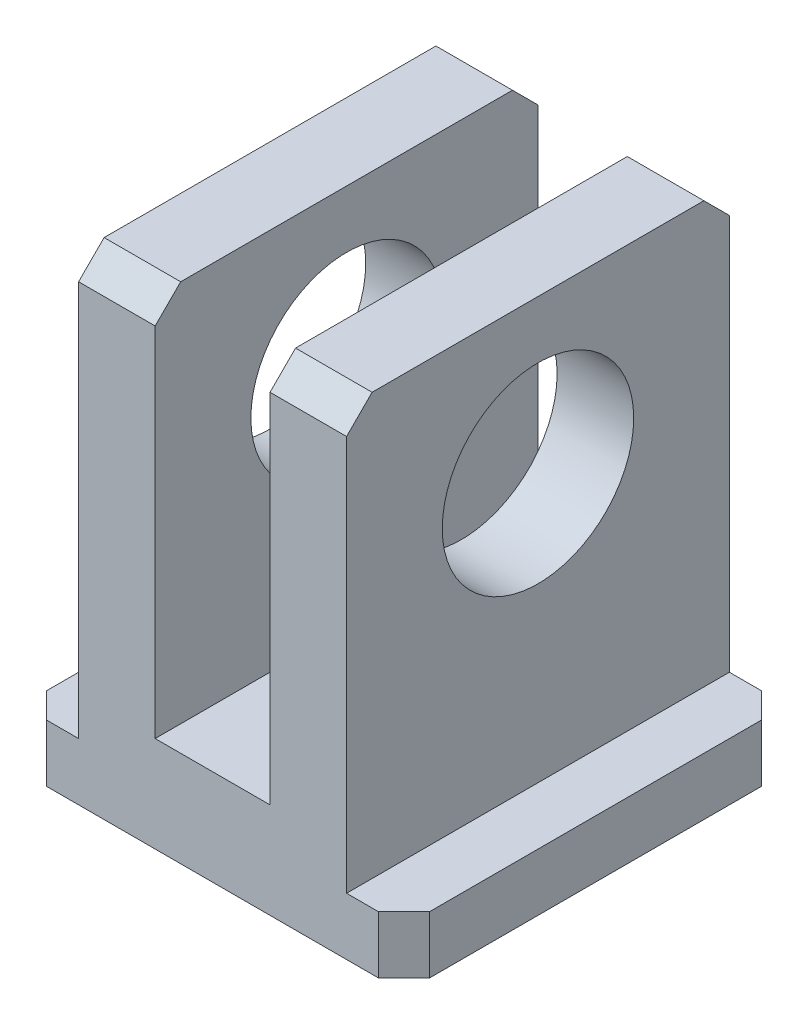
ISO-10303-21;
HEADER;
FILE_DESCRIPTION(('STEP AP214'),'2;1');
FILE_NAME('part.step','',(''),(''),'','','');
FILE_SCHEMA(('AUTOMOTIVE_DESIGN { 1 0 10303 214 1 1 1 1 }'));
ENDSEC;
DATA;
#1=APPLICATION_CONTEXT('core data for automotive mechanical design processes');
#2=APPLICATION_PROTOCOL_DEFINITION('international standard','automotive_design',2000,#1);
#3=PRODUCT_CONTEXT('',#1,'mechanical');
#4=PRODUCT('Part','Part','',(#3));
#5=PRODUCT_RELATED_PRODUCT_CATEGORY('part','',(#4));
#6=PRODUCT_DEFINITION_FORMATION('','',#4);
#7=PRODUCT_DEFINITION_CONTEXT('part definition',#1,'design');
#8=PRODUCT_DEFINITION('design','',#6,#7);
#9=PRODUCT_DEFINITION_SHAPE('','',#8);
#10=(LENGTH_UNIT() NAMED_UNIT(*) SI_UNIT(.MILLI.,.METRE.));
#11=(NAMED_UNIT(*) PLANE_ANGLE_UNIT() SI_UNIT($,.RADIAN.));
#12=(NAMED_UNIT(*) SI_UNIT($,.STERADIAN.) SOLID_ANGLE_UNIT());
#13=UNCERTAINTY_MEASURE_WITH_UNIT(LENGTH_MEASURE(1.E-05),#10,'distance_accuracy_value','');
#14=(GEOMETRIC_REPRESENTATION_CONTEXT(3) GLOBAL_UNCERTAINTY_ASSIGNED_CONTEXT((#13)) GLOBAL_UNIT_ASSIGNED_CONTEXT((#10,
#11,#12)) REPRESENTATION_CONTEXT('',''));
#15=CARTESIAN_POINT('',(0.,0.,0.));
#16=DIRECTION('',(0.,0.,1.));
#17=DIRECTION('',(1.,0.,0.));
#18=AXIS2_PLACEMENT_3D('',#15,#16,#17);
#19=CARTESIAN_POINT('',(-13.,4.5,-15.));
#20=DIRECTION('',(0.,0.,1.));
#21=DIRECTION('',(1.,0.,0.));
#22=AXIS2_PLACEMENT_3D('',#19,#20,#21);
#23=PLANE('',#22);
#24=DIRECTION('',(-1.,0.,0.));
#25=VECTOR('',#24,1.);
#26=CARTESIAN_POINT('',(40.5,35.5,-15.));
#27=LINE('',#26,#25);
#28=CARTESIAN_POINT('',(10.5,35.5,-15.));
#29=VERTEX_POINT('',#28);
#30=CARTESIAN_POINT('',(4.5,35.5,-15.));
#31=VERTEX_POINT('',#30);
#32=EDGE_CURVE('E342',#29,#31,#27,.T.);
#33=ORIENTED_EDGE('',*,*,#32,.F.);
#34=DIRECTION('',(0.,-1.,0.));
#35=VECTOR('',#34,1.);
#36=CARTESIAN_POINT('',(10.5,7.5,-15.));
#37=LINE('',#36,#35);
#38=CARTESIAN_POINT('',(10.5,4.5,-15.));
#39=VERTEX_POINT('',#38);
#40=EDGE_CURVE('E192',#29,#39,#37,.T.);
#41=ORIENTED_EDGE('',*,*,#40,.T.);
#42=DIRECTION('',(-1.,0.,0.));
#43=VECTOR('',#42,1.);
#44=CARTESIAN_POINT('',(-13.,4.5,-15.));
#45=LINE('',#44,#43);
#46=CARTESIAN_POINT('',(13.,4.5,-15.));
#47=VERTEX_POINT('',#46);
#48=EDGE_CURVE('E226',#47,#39,#45,.T.);
#49=ORIENTED_EDGE('',*,*,#48,.F.);
#50=DIRECTION('',(0.,-1.,0.));
#51=VECTOR('',#50,1.);
#52=CARTESIAN_POINT('',(13.,4.5,-15.));
#53=LINE('',#52,#51);
#54=CARTESIAN_POINT('',(13.,0.,-15.));
#55=VERTEX_POINT('',#54);
#56=EDGE_CURVE('E246',#47,#55,#53,.T.);
#57=ORIENTED_EDGE('',*,*,#56,.T.);
#58=DIRECTION('',(-1.,0.,0.));
#59=VECTOR('',#58,1.);
#60=CARTESIAN_POINT('',(-13.,0.,-15.));
#61=LINE('',#60,#59);
#62=CARTESIAN_POINT('',(-13.,0.,-15.));
#63=VERTEX_POINT('',#62);
#64=EDGE_CURVE('E225',#55,#63,#61,.T.);
#65=ORIENTED_EDGE('',*,*,#64,.T.);
#66=DIRECTION('',(0.,-1.,0.));
#67=VECTOR('',#66,1.);
#68=CARTESIAN_POINT('',(-13.,4.5,-15.));
#69=LINE('',#68,#67);
#70=CARTESIAN_POINT('',(-13.,4.5,-15.));
#71=VERTEX_POINT('',#70);
#72=EDGE_CURVE('E283',#71,#63,#69,.T.);
#73=ORIENTED_EDGE('',*,*,#72,.F.);
#74=CARTESIAN_POINT('',(-10.5,4.5,-15.));
#75=VERTEX_POINT('',#74);
#76=EDGE_CURVE('E230',#75,#71,#45,.T.);
#77=ORIENTED_EDGE('',*,*,#76,.F.);
#78=DIRECTION('',(0.,-1.,0.));
#79=VECTOR('',#78,1.);
#80=CARTESIAN_POINT('',(-10.5,7.5,-15.));
#81=LINE('',#80,#79);
#82=CARTESIAN_POINT('',(-10.5,35.5,-15.));
#83=VERTEX_POINT('',#82);
#84=EDGE_CURVE('E223',#83,#75,#81,.T.);
#85=ORIENTED_EDGE('',*,*,#84,.F.);
#86=CARTESIAN_POINT('',(-4.5,35.5,-15.));
#87=VERTEX_POINT('',#86);
#88=EDGE_CURVE('E183',#87,#83,#27,.T.);
#89=ORIENTED_EDGE('',*,*,#88,.F.);
#90=DIRECTION('',(0.,-1.,0.));
#91=VECTOR('',#90,1.);
#92=CARTESIAN_POINT('',(-4.5,37.5,-15.));
#93=LINE('',#92,#91);
#94=CARTESIAN_POINT('',(-4.5,7.5,-15.));
#95=VERTEX_POINT('',#94);
#96=EDGE_CURVE('E305',#87,#95,#93,.T.);
#97=ORIENTED_EDGE('',*,*,#96,.T.);
#98=DIRECTION('',(-1.,0.,0.));
#99=VECTOR('',#98,1.);
#100=CARTESIAN_POINT('',(-10.5,7.5,-15.));
#101=LINE('',#100,#99);
#102=CARTESIAN_POINT('',(4.5,7.5,-15.));
#103=VERTEX_POINT('',#102);
#104=EDGE_CURVE('E206',#103,#95,#101,.T.);
#105=ORIENTED_EDGE('',*,*,#104,.F.);
#106=DIRECTION('',(0.,-1.,0.));
#107=VECTOR('',#106,1.);
#108=CARTESIAN_POINT('',(4.5,37.5,-15.));
#109=LINE('',#108,#107);
#110=EDGE_CURVE('E198',#31,#103,#109,.T.);
#111=ORIENTED_EDGE('',*,*,#110,.F.);
#112=EDGE_LOOP('',(#33,#41,#49,#57,#65,#73,#77,#85,#89,#97,#105,#111));
#113=FACE_BOUND('',#112,.T.);
#114=ADVANCED_FACE('F41',(#113),#23,.F.);
#115=CARTESIAN_POINT('',(-13.,4.5,15.));
#116=DIRECTION('',(0.,0.,-1.));
#117=DIRECTION('',(-1.,0.,0.));
#118=AXIS2_PLACEMENT_3D('',#115,#116,#117);
#119=PLANE('',#118);
#120=DIRECTION('',(-1.,0.,0.));
#121=VECTOR('',#120,1.);
#122=CARTESIAN_POINT('',(40.5,35.5,15.));
#123=LINE('',#122,#121);
#124=CARTESIAN_POINT('',(-4.5,35.5,15.));
#125=VERTEX_POINT('',#124);
#126=CARTESIAN_POINT('',(-10.5,35.5,15.));
#127=VERTEX_POINT('',#126);
#128=EDGE_CURVE('E346',#125,#127,#123,.T.);
#129=ORIENTED_EDGE('',*,*,#128,.T.);
#130=DIRECTION('',(0.,-1.,0.));
#131=VECTOR('',#130,1.);
#132=CARTESIAN_POINT('',(-10.5,7.5,15.));
#133=LINE('',#132,#131);
#134=CARTESIAN_POINT('',(-10.5,4.5,15.));
#135=VERTEX_POINT('',#134);
#136=EDGE_CURVE('E221',#127,#135,#133,.T.);
#137=ORIENTED_EDGE('',*,*,#136,.T.);
#138=DIRECTION('',(1.,0.,0.));
#139=VECTOR('',#138,1.);
#140=CARTESIAN_POINT('',(-13.,4.5,15.));
#141=LINE('',#140,#139);
#142=CARTESIAN_POINT('',(-13.,4.5,15.));
#143=VERTEX_POINT('',#142);
#144=EDGE_CURVE('E237',#143,#135,#141,.T.);
#145=ORIENTED_EDGE('',*,*,#144,.F.);
#146=DIRECTION('',(0.,-1.,0.));
#147=VECTOR('',#146,1.);
#148=CARTESIAN_POINT('',(-13.,4.5,15.));
#149=LINE('',#148,#147);
#150=CARTESIAN_POINT('',(-13.,0.,15.));
#151=VERTEX_POINT('',#150);
#152=EDGE_CURVE('E274',#143,#151,#149,.T.);
#153=ORIENTED_EDGE('',*,*,#152,.T.);
#154=DIRECTION('',(1.,0.,0.));
#155=VECTOR('',#154,1.);
#156=CARTESIAN_POINT('',(-13.,0.,15.));
#157=LINE('',#156,#155);
#158=CARTESIAN_POINT('',(13.,0.,15.));
#159=VERTEX_POINT('',#158);
#160=EDGE_CURVE('E255',#151,#159,#157,.T.);
#161=ORIENTED_EDGE('',*,*,#160,.T.);
#162=DIRECTION('',(0.,-1.,0.));
#163=VECTOR('',#162,1.);
#164=CARTESIAN_POINT('',(13.,4.5,15.));
#165=LINE('',#164,#163);
#166=CARTESIAN_POINT('',(13.,4.5,15.));
#167=VERTEX_POINT('',#166);
#168=EDGE_CURVE('E271',#167,#159,#165,.T.);
#169=ORIENTED_EDGE('',*,*,#168,.F.);
#170=CARTESIAN_POINT('',(10.5,4.5,15.));
#171=VERTEX_POINT('',#170);
#172=EDGE_CURVE('E236',#171,#167,#141,.T.);
#173=ORIENTED_EDGE('',*,*,#172,.F.);
#174=DIRECTION('',(0.,-1.,0.));
#175=VECTOR('',#174,1.);
#176=CARTESIAN_POINT('',(10.5,7.5,15.));
#177=LINE('',#176,#175);
#178=CARTESIAN_POINT('',(10.5,35.5,15.));
#179=VERTEX_POINT('',#178);
#180=EDGE_CURVE('E219',#179,#171,#177,.T.);
#181=ORIENTED_EDGE('',*,*,#180,.F.);
#182=CARTESIAN_POINT('',(4.5,35.5,15.));
#183=VERTEX_POINT('',#182);
#184=EDGE_CURVE('E345',#179,#183,#123,.T.);
#185=ORIENTED_EDGE('',*,*,#184,.T.);
#186=DIRECTION('',(0.,-1.,0.));
#187=VECTOR('',#186,1.);
#188=CARTESIAN_POINT('',(4.5,37.5,15.));
#189=LINE('',#188,#187);
#190=CARTESIAN_POINT('',(4.5,7.5,15.));
#191=VERTEX_POINT('',#190);
#192=EDGE_CURVE('E202',#183,#191,#189,.T.);
#193=ORIENTED_EDGE('',*,*,#192,.T.);
#194=DIRECTION('',(1.,0.,0.));
#195=VECTOR('',#194,1.);
#196=CARTESIAN_POINT('',(-10.5,7.5,15.));
#197=LINE('',#196,#195);
#198=CARTESIAN_POINT('',(-4.5,7.5,15.));
#199=VERTEX_POINT('',#198);
#200=EDGE_CURVE('E209',#199,#191,#197,.T.);
#201=ORIENTED_EDGE('',*,*,#200,.F.);
#202=DIRECTION('',(0.,-1.,0.));
#203=VECTOR('',#202,1.);
#204=CARTESIAN_POINT('',(-4.5,37.5,15.));
#205=LINE('',#204,#203);
#206=EDGE_CURVE('E216',#125,#199,#205,.T.);
#207=ORIENTED_EDGE('',*,*,#206,.F.);
#208=EDGE_LOOP('',(#129,#137,#145,#153,#161,#169,#173,#181,#185,#193,#201,#207));
#209=FACE_BOUND('',#208,.T.);
#210=ADVANCED_FACE('F362',(#209),#119,.F.);
#211=CARTESIAN_POINT('',(-10.5,7.5,-15.));
#212=DIRECTION('',(1.,0.,0.));
#213=DIRECTION('',(0.,0.,-1.));
#214=AXIS2_PLACEMENT_3D('',#211,#212,#213);
#215=PLANE('',#214);
#216=DIRECTION('',(0.,-0.707106781186549,0.707106781186546));
#217=VECTOR('',#216,1.);
#218=CARTESIAN_POINT('',(-10.5,36.5,14.0000000000001));
#219=LINE('',#218,#217);
#220=CARTESIAN_POINT('',(-10.5,37.5,13.));
#221=VERTEX_POINT('',#220);
#222=EDGE_CURVE('E333',#221,#127,#219,.T.);
#223=ORIENTED_EDGE('',*,*,#222,.F.);
#224=DIRECTION('',(0.,0.,1.));
#225=VECTOR('',#224,1.);
#226=CARTESIAN_POINT('',(-10.5,37.5,15.));
#227=LINE('',#226,#225);
#228=CARTESIAN_POINT('',(-10.5,37.5,-13.));
#229=VERTEX_POINT('',#228);
#230=EDGE_CURVE('E309',#229,#221,#227,.T.);
#231=ORIENTED_EDGE('',*,*,#230,.F.);
#232=DIRECTION('',(0.,0.707106781186548,0.707106781186548));
#233=VECTOR('',#232,1.);
#234=CARTESIAN_POINT('',(-10.5,21.5,-29.));
#235=LINE('',#234,#233);
#236=EDGE_CURVE('E193',#83,#229,#235,.T.);
#237=ORIENTED_EDGE('',*,*,#236,.F.);
#238=ORIENTED_EDGE('',*,*,#84,.T.);
#239=DIRECTION('',(0.,0.,1.));
#240=VECTOR('',#239,1.);
#241=CARTESIAN_POINT('',(-10.5,4.5,-15.));
#242=LINE('',#241,#240);
#243=EDGE_CURVE('E213',#75,#135,#242,.T.);
#244=ORIENTED_EDGE('',*,*,#243,.T.);
#245=ORIENTED_EDGE('',*,*,#136,.F.);
#246=EDGE_LOOP('',(#223,#231,#237,#238,#244,#245));
#247=FACE_BOUND('',#246,.T.);
#248=CARTESIAN_POINT('',(-10.5,25.5,0.));
#249=DIRECTION('',(1.,0.,0.));
#250=DIRECTION('',(0.,0.,-1.));
#251=AXIS2_PLACEMENT_3D('',#248,#249,#250);
#252=CIRCLE('',#251,7.5);
#253=CARTESIAN_POINT('',(-10.5,25.5,-7.5));
#254=VERTEX_POINT('',#253);
#255=EDGE_CURVE('E318',#254,#254,#252,.F.);
#256=ORIENTED_EDGE('',*,*,#255,.F.);
#257=EDGE_LOOP('',(#256));
#258=FACE_BOUND('',#257,.T.);
#259=ADVANCED_FACE('F394',(#247,#258),#215,.F.);
#260=CARTESIAN_POINT('',(10.5,7.5,-15.));
#261=DIRECTION('',(-1.,0.,0.));
#262=DIRECTION('',(0.,0.,1.));
#263=AXIS2_PLACEMENT_3D('',#260,#261,#262);
#264=PLANE('',#263);
#265=DIRECTION('',(0.,0.707106781186549,-0.707106781186546));
#266=VECTOR('',#265,1.);
#267=CARTESIAN_POINT('',(10.5,36.5,14.));
#268=LINE('',#267,#266);
#269=CARTESIAN_POINT('',(10.5,37.5,13.));
#270=VERTEX_POINT('',#269);
#271=EDGE_CURVE('E56',#179,#270,#268,.T.);
#272=ORIENTED_EDGE('',*,*,#271,.F.);
#273=ORIENTED_EDGE('',*,*,#180,.T.);
#274=DIRECTION('',(0.,0.,-1.));
#275=VECTOR('',#274,1.);
#276=CARTESIAN_POINT('',(10.5,4.5,-15.));
#277=LINE('',#276,#275);
#278=EDGE_CURVE('E210',#171,#39,#277,.T.);
#279=ORIENTED_EDGE('',*,*,#278,.T.);
#280=ORIENTED_EDGE('',*,*,#40,.F.);
#281=DIRECTION('',(0.,-0.707106781186548,-0.707106781186548));
#282=VECTOR('',#281,1.);
#283=CARTESIAN_POINT('',(10.5,21.5,-29.));
#284=LINE('',#283,#282);
#285=CARTESIAN_POINT('',(10.5,37.5,-13.));
#286=VERTEX_POINT('',#285);
#287=EDGE_CURVE('E177',#286,#29,#284,.T.);
#288=ORIENTED_EDGE('',*,*,#287,.F.);
#289=DIRECTION('',(0.,0.,-1.));
#290=VECTOR('',#289,1.);
#291=CARTESIAN_POINT('',(10.5,37.5,15.));
#292=LINE('',#291,#290);
#293=EDGE_CURVE('E190',#270,#286,#292,.T.);
#294=ORIENTED_EDGE('',*,*,#293,.F.);
#295=EDGE_LOOP('',(#272,#273,#279,#280,#288,#294));
#296=FACE_BOUND('',#295,.T.);
#297=CARTESIAN_POINT('',(10.5,25.5,0.));
#298=DIRECTION('',(-1.,0.,0.));
#299=DIRECTION('',(0.,0.,1.));
#300=AXIS2_PLACEMENT_3D('',#297,#298,#299);
#301=CIRCLE('',#300,7.5);
#302=CARTESIAN_POINT('',(10.5,25.5,7.5));
#303=VERTEX_POINT('',#302);
#304=EDGE_CURVE('E324',#303,#303,#301,.F.);
#305=ORIENTED_EDGE('',*,*,#304,.F.);
#306=EDGE_LOOP('',(#305));
#307=FACE_BOUND('',#306,.T.);
#308=ADVANCED_FACE('F188',(#296,#307),#264,.F.);
#309=CARTESIAN_POINT('',(4.5,37.5,-15.));
#310=DIRECTION('',(1.,0.,0.));
#311=DIRECTION('',(0.,0.,-1.));
#312=AXIS2_PLACEMENT_3D('',#309,#310,#311);
#313=PLANE('',#312);
#314=DIRECTION('',(0.,-0.707106781186549,0.707106781186546));
#315=VECTOR('',#314,1.);
#316=CARTESIAN_POINT('',(4.5,51.5,-0.999999999999952));
#317=LINE('',#316,#315);
#318=CARTESIAN_POINT('',(4.5,37.5,13.));
#319=VERTEX_POINT('',#318);
#320=EDGE_CURVE('E336',#319,#183,#317,.T.);
#321=ORIENTED_EDGE('',*,*,#320,.F.);
#322=DIRECTION('',(0.,0.,1.));
#323=VECTOR('',#322,1.);
#324=CARTESIAN_POINT('',(4.5,37.5,-15.));
#325=LINE('',#324,#323);
#326=CARTESIAN_POINT('',(4.5,37.5,-13.));
#327=VERTEX_POINT('',#326);
#328=EDGE_CURVE('E197',#327,#319,#325,.T.);
#329=ORIENTED_EDGE('',*,*,#328,.F.);
#330=DIRECTION('',(0.,0.707106781186548,0.707106781186548));
#331=VECTOR('',#330,1.);
#332=CARTESIAN_POINT('',(4.5,36.5,-14.));
#333=LINE('',#332,#331);
#334=EDGE_CURVE('E64',#31,#327,#333,.T.);
#335=ORIENTED_EDGE('',*,*,#334,.F.);
#336=ORIENTED_EDGE('',*,*,#110,.T.);
#337=DIRECTION('',(0.,0.,1.));
#338=VECTOR('',#337,1.);
#339=CARTESIAN_POINT('',(4.5,7.5,-15.));
#340=LINE('',#339,#338);
#341=EDGE_CURVE('E200',#103,#191,#340,.T.);
#342=ORIENTED_EDGE('',*,*,#341,.T.);
#343=ORIENTED_EDGE('',*,*,#192,.F.);
#344=EDGE_LOOP('',(#321,#329,#335,#336,#342,#343));
#345=FACE_BOUND('',#344,.T.);
#346=CARTESIAN_POINT('',(4.5,25.5,0.));
#347=DIRECTION('',(1.,0.,0.));
#348=DIRECTION('',(0.,0.,-1.));
#349=AXIS2_PLACEMENT_3D('',#346,#347,#348);
#350=CIRCLE('',#349,7.5);
#351=CARTESIAN_POINT('',(4.5,25.5,-7.5));
#352=VERTEX_POINT('',#351);
#353=EDGE_CURVE('E328',#352,#352,#350,.F.);
#354=ORIENTED_EDGE('',*,*,#353,.F.);
#355=EDGE_LOOP('',(#354));
#356=FACE_BOUND('',#355,.T.);
#357=ADVANCED_FACE('F354',(#345,#356),#313,.F.);
#358=CARTESIAN_POINT('',(0.,37.5,0.));
#359=DIRECTION('',(0.,1.,0.));
#360=DIRECTION('',(0.,0.,1.));
#361=AXIS2_PLACEMENT_3D('',#358,#359,#360);
#362=PLANE('',#361);
#363=ORIENTED_EDGE('',*,*,#328,.T.);
#364=DIRECTION('',(-1.,0.,0.));
#365=VECTOR('',#364,1.);
#366=CARTESIAN_POINT('',(40.5,37.5,13.));
#367=LINE('',#366,#365);
#368=EDGE_CURVE('E196',#270,#319,#367,.T.);
#369=ORIENTED_EDGE('',*,*,#368,.F.);
#370=ORIENTED_EDGE('',*,*,#293,.T.);
#371=DIRECTION('',(-1.,0.,0.));
#372=VECTOR('',#371,1.);
#373=CARTESIAN_POINT('',(40.5,37.5,-13.));
#374=LINE('',#373,#372);
#375=EDGE_CURVE('E174',#286,#327,#374,.T.);
#376=ORIENTED_EDGE('',*,*,#375,.T.);
#377=EDGE_LOOP('',(#363,#369,#370,#376));
#378=FACE_BOUND('',#377,.T.);
#379=ADVANCED_FACE('F195',(#378),#362,.T.);
#380=CARTESIAN_POINT('',(-4.5,37.5,-15.));
#381=DIRECTION('',(-1.,0.,0.));
#382=DIRECTION('',(0.,0.,1.));
#383=AXIS2_PLACEMENT_3D('',#380,#381,#382);
#384=PLANE('',#383);
#385=DIRECTION('',(0.,0.707106781186549,-0.707106781186546));
#386=VECTOR('',#385,1.);
#387=CARTESIAN_POINT('',(-4.5,51.5,-0.999999999999947));
#388=LINE('',#387,#386);
#389=CARTESIAN_POINT('',(-4.5,37.5,13.));
#390=VERTEX_POINT('',#389);
#391=EDGE_CURVE('E338',#125,#390,#388,.T.);
#392=ORIENTED_EDGE('',*,*,#391,.F.);
#393=ORIENTED_EDGE('',*,*,#206,.T.);
#394=DIRECTION('',(0.,0.,-1.));
#395=VECTOR('',#394,1.);
#396=CARTESIAN_POINT('',(-4.5,7.5,-15.));
#397=LINE('',#396,#395);
#398=EDGE_CURVE('E312',#199,#95,#397,.T.);
#399=ORIENTED_EDGE('',*,*,#398,.T.);
#400=ORIENTED_EDGE('',*,*,#96,.F.);
#401=DIRECTION('',(0.,-0.707106781186548,-0.707106781186548));
#402=VECTOR('',#401,1.);
#403=CARTESIAN_POINT('',(-4.5,36.5,-14.));
#404=LINE('',#403,#402);
#405=CARTESIAN_POINT('',(-4.5,37.5,-13.));
#406=VERTEX_POINT('',#405);
#407=EDGE_CURVE('E290',#406,#87,#404,.T.);
#408=ORIENTED_EDGE('',*,*,#407,.F.);
#409=DIRECTION('',(0.,0.,-1.));
#410=VECTOR('',#409,1.);
#411=CARTESIAN_POINT('',(-4.5,37.5,-15.));
#412=LINE('',#411,#410);
#413=EDGE_CURVE('E303',#390,#406,#412,.T.);
#414=ORIENTED_EDGE('',*,*,#413,.F.);
#415=EDGE_LOOP('',(#392,#393,#399,#400,#408,#414));
#416=FACE_BOUND('',#415,.T.);
#417=CARTESIAN_POINT('',(-4.5,25.5,0.));
#418=DIRECTION('',(-1.,0.,0.));
#419=DIRECTION('',(0.,0.,1.));
#420=AXIS2_PLACEMENT_3D('',#417,#418,#419);
#421=CIRCLE('',#420,7.5);
#422=CARTESIAN_POINT('',(-4.5,25.5,7.5));
#423=VERTEX_POINT('',#422);
#424=EDGE_CURVE('E44',#423,#423,#421,.F.);
#425=ORIENTED_EDGE('',*,*,#424,.F.);
#426=EDGE_LOOP('',(#425));
#427=FACE_BOUND('',#426,.T.);
#428=ADVANCED_FACE('F301',(#416,#427),#384,.F.);
#429=CARTESIAN_POINT('',(0.,37.5,0.));
#430=DIRECTION('',(0.,-1.,0.));
#431=DIRECTION('',(0.,0.,-1.));
#432=AXIS2_PLACEMENT_3D('',#429,#430,#431);
#433=PLANE('',#432);
#434=DIRECTION('',(-1.,0.,0.));
#435=VECTOR('',#434,1.);
#436=CARTESIAN_POINT('',(0.,37.5,13.));
#437=LINE('',#436,#435);
#438=EDGE_CURVE('E11',#390,#221,#437,.T.);
#439=ORIENTED_EDGE('',*,*,#438,.F.);
#440=ORIENTED_EDGE('',*,*,#413,.T.);
#441=DIRECTION('',(1.,0.,0.));
#442=VECTOR('',#441,1.);
#443=CARTESIAN_POINT('',(0.,37.5,-13.));
#444=LINE('',#443,#442);
#445=EDGE_CURVE('E49',#229,#406,#444,.T.);
#446=ORIENTED_EDGE('',*,*,#445,.F.);
#447=ORIENTED_EDGE('',*,*,#230,.T.);
#448=EDGE_LOOP('',(#439,#440,#446,#447));
#449=FACE_BOUND('',#448,.T.);
#450=ADVANCED_FACE('F308',(#449),#433,.F.);
#451=CARTESIAN_POINT('',(0.,7.5,0.));
#452=DIRECTION('',(0.,-1.,0.));
#453=DIRECTION('',(0.,0.,-1.));
#454=AXIS2_PLACEMENT_3D('',#451,#452,#453);
#455=PLANE('',#454);
#456=ORIENTED_EDGE('',*,*,#398,.F.);
#457=ORIENTED_EDGE('',*,*,#200,.T.);
#458=ORIENTED_EDGE('',*,*,#341,.F.);
#459=ORIENTED_EDGE('',*,*,#104,.T.);
#460=EDGE_LOOP('',(#456,#457,#458,#459));
#461=FACE_BOUND('',#460,.T.);
#462=ADVANCED_FACE('F361',(#461),#455,.F.);
#463=CARTESIAN_POINT('',(0.,4.5,0.));
#464=DIRECTION('',(0.,1.,0.));
#465=DIRECTION('',(0.,0.,1.));
#466=AXIS2_PLACEMENT_3D('',#463,#464,#465);
#467=PLANE('',#466);
#468=ORIENTED_EDGE('',*,*,#278,.F.);
#469=ORIENTED_EDGE('',*,*,#172,.T.);
#470=DIRECTION('',(0.707106781186548,0.,-0.707106781186548));
#471=VECTOR('',#470,1.);
#472=CARTESIAN_POINT('',(13.,4.5,15.));
#473=LINE('',#472,#471);
#474=CARTESIAN_POINT('',(15.,4.5,13.));
#475=VERTEX_POINT('',#474);
#476=EDGE_CURVE('E240',#167,#475,#473,.T.);
#477=ORIENTED_EDGE('',*,*,#476,.T.);
#478=DIRECTION('',(0.,0.,-1.));
#479=VECTOR('',#478,1.);
#480=CARTESIAN_POINT('',(15.,4.5,13.));
#481=LINE('',#480,#479);
#482=CARTESIAN_POINT('',(15.,4.5,-13.));
#483=VERTEX_POINT('',#482);
#484=EDGE_CURVE('E242',#475,#483,#481,.T.);
#485=ORIENTED_EDGE('',*,*,#484,.T.);
#486=DIRECTION('',(-0.707106781186548,0.,-0.707106781186548));
#487=VECTOR('',#486,1.);
#488=CARTESIAN_POINT('',(13.,4.5,-15.));
#489=LINE('',#488,#487);
#490=EDGE_CURVE('E244',#483,#47,#489,.T.);
#491=ORIENTED_EDGE('',*,*,#490,.T.);
#492=ORIENTED_EDGE('',*,*,#48,.T.);
#493=EDGE_LOOP('',(#468,#469,#477,#485,#491,#492));
#494=FACE_BOUND('',#493,.T.);
#495=ADVANCED_FACE('F369',(#494),#467,.T.);
#496=CARTESIAN_POINT('',(-15.,4.5,-13.));
#497=DIRECTION('',(0.707106781186547,0.,0.707106781186547));
#498=DIRECTION('',(0.707106781186548,0.,-0.707106781186548));
#499=AXIS2_PLACEMENT_3D('',#496,#497,#498);
#500=PLANE('',#499);
#501=DIRECTION('',(-0.707106781186548,0.,0.707106781186548));
#502=VECTOR('',#501,1.);
#503=CARTESIAN_POINT('',(-15.,0.,-13.));
#504=LINE('',#503,#502);
#505=CARTESIAN_POINT('',(-15.,0.,-13.));
#506=VERTEX_POINT('',#505);
#507=EDGE_CURVE('E249',#63,#506,#504,.T.);
#508=ORIENTED_EDGE('',*,*,#507,.T.);
#509=DIRECTION('',(0.,-1.,0.));
#510=VECTOR('',#509,1.);
#511=CARTESIAN_POINT('',(-15.,4.5,-13.));
#512=LINE('',#511,#510);
#513=CARTESIAN_POINT('',(-15.,4.5,-13.));
#514=VERTEX_POINT('',#513);
#515=EDGE_CURVE('E280',#514,#506,#512,.T.);
#516=ORIENTED_EDGE('',*,*,#515,.F.);
#517=DIRECTION('',(-0.707106781186548,0.,0.707106781186548));
#518=VECTOR('',#517,1.);
#519=CARTESIAN_POINT('',(-15.,4.5,-13.));
#520=LINE('',#519,#518);
#521=EDGE_CURVE('E229',#71,#514,#520,.T.);
#522=ORIENTED_EDGE('',*,*,#521,.F.);
#523=ORIENTED_EDGE('',*,*,#72,.T.);
#524=EDGE_LOOP('',(#508,#516,#522,#523));
#525=FACE_BOUND('',#524,.T.);
#526=ADVANCED_FACE('F385',(#525),#500,.F.);
#527=CARTESIAN_POINT('',(-15.,4.5,13.));
#528=DIRECTION('',(1.,0.,0.));
#529=DIRECTION('',(0.,0.,-1.));
#530=AXIS2_PLACEMENT_3D('',#527,#528,#529);
#531=PLANE('',#530);
#532=DIRECTION('',(0.,0.,1.));
#533=VECTOR('',#532,1.);
#534=CARTESIAN_POINT('',(-15.,0.,13.));
#535=LINE('',#534,#533);
#536=CARTESIAN_POINT('',(-15.,0.,13.));
#537=VERTEX_POINT('',#536);
#538=EDGE_CURVE('E251',#506,#537,#535,.T.);
#539=ORIENTED_EDGE('',*,*,#538,.T.);
#540=DIRECTION('',(0.,-1.,0.));
#541=VECTOR('',#540,1.);
#542=CARTESIAN_POINT('',(-15.,4.5,13.));
#543=LINE('',#542,#541);
#544=CARTESIAN_POINT('',(-15.,4.5,13.));
#545=VERTEX_POINT('',#544);
#546=EDGE_CURVE('E277',#545,#537,#543,.T.);
#547=ORIENTED_EDGE('',*,*,#546,.F.);
#548=DIRECTION('',(0.,0.,1.));
#549=VECTOR('',#548,1.);
#550=CARTESIAN_POINT('',(-15.,4.5,13.));
#551=LINE('',#550,#549);
#552=EDGE_CURVE('E232',#514,#545,#551,.T.);
#553=ORIENTED_EDGE('',*,*,#552,.F.);
#554=ORIENTED_EDGE('',*,*,#515,.T.);
#555=EDGE_LOOP('',(#539,#547,#553,#554));
#556=FACE_BOUND('',#555,.T.);
#557=ADVANCED_FACE('F427',(#556),#531,.F.);
#558=CARTESIAN_POINT('',(-15.,4.5,13.));
#559=DIRECTION('',(0.707106781186547,0.,-0.707106781186547));
#560=DIRECTION('',(-0.707106781186548,0.,-0.707106781186548));
#561=AXIS2_PLACEMENT_3D('',#558,#559,#560);
#562=PLANE('',#561);
#563=DIRECTION('',(0.707106781186548,0.,0.707106781186548));
#564=VECTOR('',#563,1.);
#565=CARTESIAN_POINT('',(-15.,0.,13.));
#566=LINE('',#565,#564);
#567=EDGE_CURVE('E253',#537,#151,#566,.T.);
#568=ORIENTED_EDGE('',*,*,#567,.T.);
#569=ORIENTED_EDGE('',*,*,#152,.F.);
#570=DIRECTION('',(0.707106781186548,0.,0.707106781186548));
#571=VECTOR('',#570,1.);
#572=CARTESIAN_POINT('',(-15.,4.5,13.));
#573=LINE('',#572,#571);
#574=EDGE_CURVE('E234',#545,#143,#573,.T.);
#575=ORIENTED_EDGE('',*,*,#574,.F.);
#576=ORIENTED_EDGE('',*,*,#546,.T.);
#577=EDGE_LOOP('',(#568,#569,#575,#576));
#578=FACE_BOUND('',#577,.T.);
#579=ADVANCED_FACE('F424',(#578),#562,.F.);
#580=CARTESIAN_POINT('',(13.,4.5,15.));
#581=DIRECTION('',(-0.707106781186547,0.,-0.707106781186547));
#582=DIRECTION('',(-0.707106781186548,0.,0.707106781186548));
#583=AXIS2_PLACEMENT_3D('',#580,#581,#582);
#584=PLANE('',#583);
#585=DIRECTION('',(0.707106781186548,0.,-0.707106781186548));
#586=VECTOR('',#585,1.);
#587=CARTESIAN_POINT('',(13.,0.,15.));
#588=LINE('',#587,#586);
#589=CARTESIAN_POINT('',(15.,0.,13.));
#590=VERTEX_POINT('',#589);
#591=EDGE_CURVE('E257',#159,#590,#588,.T.);
#592=ORIENTED_EDGE('',*,*,#591,.T.);
#593=DIRECTION('',(0.,-1.,0.));
#594=VECTOR('',#593,1.);
#595=CARTESIAN_POINT('',(15.,4.5,13.));
#596=LINE('',#595,#594);
#597=EDGE_CURVE('E268',#475,#590,#596,.T.);
#598=ORIENTED_EDGE('',*,*,#597,.F.);
#599=ORIENTED_EDGE('',*,*,#476,.F.);
#600=ORIENTED_EDGE('',*,*,#168,.T.);
#601=EDGE_LOOP('',(#592,#598,#599,#600));
#602=FACE_BOUND('',#601,.T.);
#603=ADVANCED_FACE('F422',(#602),#584,.F.);
#604=CARTESIAN_POINT('',(15.,4.5,13.));
#605=DIRECTION('',(-1.,0.,0.));
#606=DIRECTION('',(0.,0.,1.));
#607=AXIS2_PLACEMENT_3D('',#604,#605,#606);
#608=PLANE('',#607);
#609=DIRECTION('',(0.,0.,-1.));
#610=VECTOR('',#609,1.);
#611=CARTESIAN_POINT('',(15.,0.,13.));
#612=LINE('',#611,#610);
#613=CARTESIAN_POINT('',(15.,0.,-13.));
#614=VERTEX_POINT('',#613);
#615=EDGE_CURVE('E259',#590,#614,#612,.T.);
#616=ORIENTED_EDGE('',*,*,#615,.T.);
#617=DIRECTION('',(0.,-1.,0.));
#618=VECTOR('',#617,1.);
#619=CARTESIAN_POINT('',(15.,4.5,-13.));
#620=LINE('',#619,#618);
#621=EDGE_CURVE('E265',#483,#614,#620,.T.);
#622=ORIENTED_EDGE('',*,*,#621,.F.);
#623=ORIENTED_EDGE('',*,*,#484,.F.);
#624=ORIENTED_EDGE('',*,*,#597,.T.);
#625=EDGE_LOOP('',(#616,#622,#623,#624));
#626=FACE_BOUND('',#625,.T.);
#627=ADVANCED_FACE('F446',(#626),#608,.F.);
#628=CARTESIAN_POINT('',(13.,4.5,-15.));
#629=DIRECTION('',(-0.707106781186547,0.,0.707106781186547));
#630=DIRECTION('',(0.707106781186548,0.,0.707106781186548));
#631=AXIS2_PLACEMENT_3D('',#628,#629,#630);
#632=PLANE('',#631);
#633=DIRECTION('',(-0.707106781186548,0.,-0.707106781186548));
#634=VECTOR('',#633,1.);
#635=CARTESIAN_POINT('',(13.,0.,-15.));
#636=LINE('',#635,#634);
#637=EDGE_CURVE('E261',#614,#55,#636,.T.);
#638=ORIENTED_EDGE('',*,*,#637,.T.);
#639=ORIENTED_EDGE('',*,*,#56,.F.);
#640=ORIENTED_EDGE('',*,*,#490,.F.);
#641=ORIENTED_EDGE('',*,*,#621,.T.);
#642=EDGE_LOOP('',(#638,#639,#640,#641));
#643=FACE_BOUND('',#642,.T.);
#644=ADVANCED_FACE('F442',(#643),#632,.F.);
#645=ORIENTED_EDGE('',*,*,#243,.F.);
#646=ORIENTED_EDGE('',*,*,#76,.T.);
#647=ORIENTED_EDGE('',*,*,#521,.T.);
#648=ORIENTED_EDGE('',*,*,#552,.T.);
#649=ORIENTED_EDGE('',*,*,#574,.T.);
#650=ORIENTED_EDGE('',*,*,#144,.T.);
#651=EDGE_LOOP('',(#645,#646,#647,#648,#649,#650));
#652=FACE_BOUND('',#651,.T.);
#653=ADVANCED_FACE('F390',(#652),#467,.T.);
#654=CARTESIAN_POINT('',(0.,0.,0.));
#655=DIRECTION('',(0.,1.,0.));
#656=DIRECTION('',(0.,0.,1.));
#657=AXIS2_PLACEMENT_3D('',#654,#655,#656);
#658=PLANE('',#657);
#659=ORIENTED_EDGE('',*,*,#64,.F.);
#660=ORIENTED_EDGE('',*,*,#637,.F.);
#661=ORIENTED_EDGE('',*,*,#615,.F.);
#662=ORIENTED_EDGE('',*,*,#591,.F.);
#663=ORIENTED_EDGE('',*,*,#160,.F.);
#664=ORIENTED_EDGE('',*,*,#567,.F.);
#665=ORIENTED_EDGE('',*,*,#538,.F.);
#666=ORIENTED_EDGE('',*,*,#507,.F.);
#667=EDGE_LOOP('',(#659,#660,#661,#662,#663,#664,#665,#666));
#668=FACE_BOUND('',#667,.T.);
#669=ADVANCED_FACE('F378',(#668),#658,.F.);
#670=CARTESIAN_POINT('',(40.5,37.5,-13.));
#671=DIRECTION('',(0.,0.707106781186547,-0.707106781186547));
#672=DIRECTION('',(0.,0.707106781186548,0.707106781186548));
#673=AXIS2_PLACEMENT_3D('',#670,#671,#672);
#674=PLANE('',#673);
#675=ORIENTED_EDGE('',*,*,#236,.T.);
#676=ORIENTED_EDGE('',*,*,#445,.T.);
#677=ORIENTED_EDGE('',*,*,#407,.T.);
#678=ORIENTED_EDGE('',*,*,#88,.T.);
#679=EDGE_LOOP('',(#675,#676,#677,#678));
#680=FACE_BOUND('',#679,.T.);
#681=ADVANCED_FACE('F289',(#680),#674,.T.);
#682=CARTESIAN_POINT('',(40.5,37.5,13.));
#683=DIRECTION('',(0.,0.707106781186546,0.707106781186549));
#684=DIRECTION('',(0.,-0.707106781186549,0.707106781186546));
#685=AXIS2_PLACEMENT_3D('',#682,#683,#684);
#686=PLANE('',#685);
#687=ORIENTED_EDGE('',*,*,#222,.T.);
#688=ORIENTED_EDGE('',*,*,#128,.F.);
#689=ORIENTED_EDGE('',*,*,#391,.T.);
#690=ORIENTED_EDGE('',*,*,#438,.T.);
#691=EDGE_LOOP('',(#687,#688,#689,#690));
#692=FACE_BOUND('',#691,.T.);
#693=ADVANCED_FACE('F397',(#692),#686,.T.);
#694=CARTESIAN_POINT('',(40.5,25.5,0.));
#695=DIRECTION('',(-1.,0.,0.));
#696=DIRECTION('',(0.,0.,1.));
#697=AXIS2_PLACEMENT_3D('',#694,#695,#696);
#698=CYLINDRICAL_SURFACE('',#697,7.5);
#699=ORIENTED_EDGE('',*,*,#424,.T.);
#700=EDGE_LOOP('',(#699));
#701=FACE_BOUND('',#700,.T.);
#702=ORIENTED_EDGE('',*,*,#255,.T.);
#703=EDGE_LOOP('',(#702));
#704=FACE_BOUND('',#703,.T.);
#705=ADVANCED_FACE('F399',(#701,#704),#698,.F.);
#706=ORIENTED_EDGE('',*,*,#287,.T.);
#707=ORIENTED_EDGE('',*,*,#32,.T.);
#708=ORIENTED_EDGE('',*,*,#334,.T.);
#709=ORIENTED_EDGE('',*,*,#375,.F.);
#710=EDGE_LOOP('',(#706,#707,#708,#709));
#711=FACE_BOUND('',#710,.T.);
#712=ADVANCED_FACE('F176',(#711),#674,.T.);
#713=ORIENTED_EDGE('',*,*,#271,.T.);
#714=ORIENTED_EDGE('',*,*,#368,.T.);
#715=ORIENTED_EDGE('',*,*,#320,.T.);
#716=ORIENTED_EDGE('',*,*,#184,.F.);
#717=EDGE_LOOP('',(#713,#714,#715,#716));
#718=FACE_BOUND('',#717,.T.);
#719=ADVANCED_FACE('F363',(#718),#686,.T.);
#720=ORIENTED_EDGE('',*,*,#353,.T.);
#721=EDGE_LOOP('',(#720));
#722=FACE_BOUND('',#721,.T.);
#723=ORIENTED_EDGE('',*,*,#304,.T.);
#724=EDGE_LOOP('',(#723));
#725=FACE_BOUND('',#724,.T.);
#726=ADVANCED_FACE('F407',(#722,#725),#698,.F.);
#727=CLOSED_SHELL('',(#114,#210,#259,#308,#357,#379,#428,#450,#462,#495,#526,#557,#579,#603,
#627,#644,#653,#669,#681,#693,#705,#712,#719,#726));
#728=MANIFOLD_SOLID_BREP('B2',#727);
#729=ADVANCED_BREP_SHAPE_REPRESENTATION('',(#18,#728),#14);
#730=SHAPE_DEFINITION_REPRESENTATION(#9,#729);
ENDSEC;
END-ISO-10303-21;
